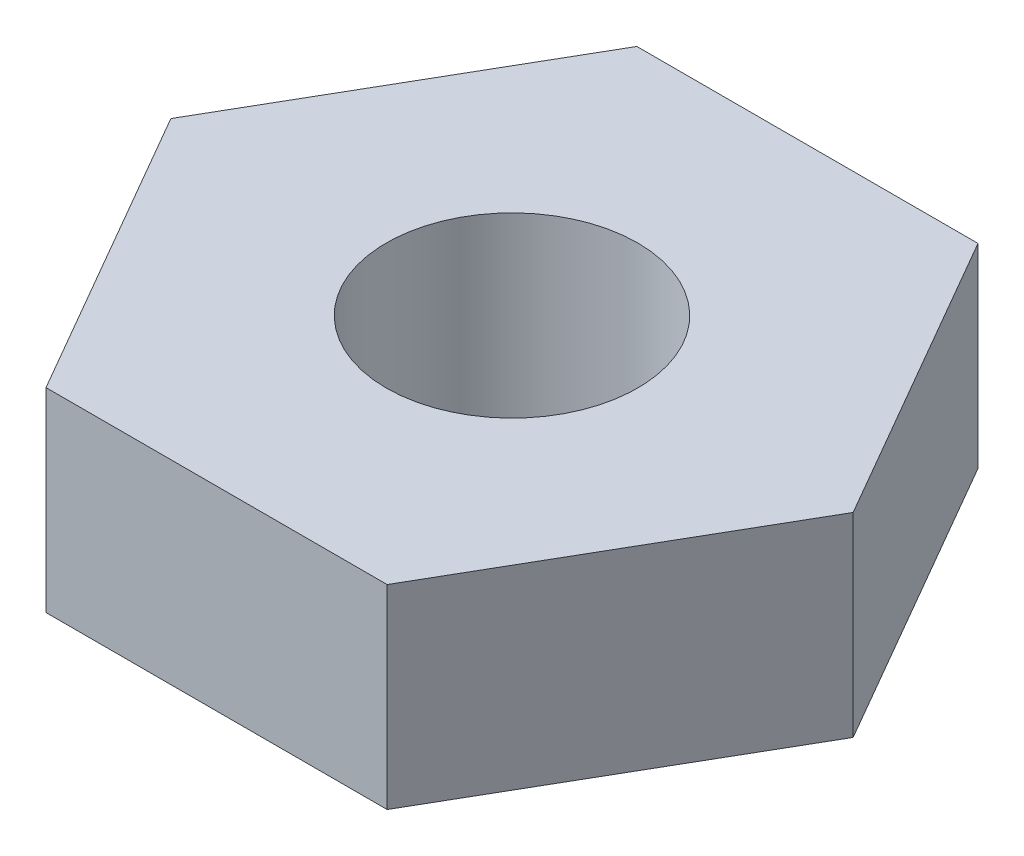
ISO-10303-21;
HEADER;
FILE_DESCRIPTION(('STEP AP214'),'2;1');
FILE_NAME('part.step','',(''),(''),'','','');
FILE_SCHEMA(('AUTOMOTIVE_DESIGN { 1 0 10303 214 1 1 1 1 }'));
ENDSEC;
DATA;
#1=APPLICATION_CONTEXT('core data for automotive mechanical design processes');
#2=APPLICATION_PROTOCOL_DEFINITION('international standard','automotive_design',2000,#1);
#3=PRODUCT_CONTEXT('',#1,'mechanical');
#4=PRODUCT('Part','Part','',(#3));
#5=PRODUCT_RELATED_PRODUCT_CATEGORY('part','',(#4));
#6=PRODUCT_DEFINITION_FORMATION('','',#4);
#7=PRODUCT_DEFINITION_CONTEXT('part definition',#1,'design');
#8=PRODUCT_DEFINITION('design','',#6,#7);
#9=PRODUCT_DEFINITION_SHAPE('','',#8);
#10=(LENGTH_UNIT() NAMED_UNIT(*) SI_UNIT(.MILLI.,.METRE.));
#11=(NAMED_UNIT(*) PLANE_ANGLE_UNIT() SI_UNIT($,.RADIAN.));
#12=(NAMED_UNIT(*) SI_UNIT($,.STERADIAN.) SOLID_ANGLE_UNIT());
#13=UNCERTAINTY_MEASURE_WITH_UNIT(LENGTH_MEASURE(1.E-05),#10,'distance_accuracy_value','');
#14=(GEOMETRIC_REPRESENTATION_CONTEXT(3) GLOBAL_UNCERTAINTY_ASSIGNED_CONTEXT((#13)) GLOBAL_UNIT_ASSIGNED_CONTEXT((#10,
#11,#12)) REPRESENTATION_CONTEXT('',''));
#15=CARTESIAN_POINT('',(0.,0.,0.));
#16=DIRECTION('',(0.,0.,1.));
#17=DIRECTION('',(1.,0.,0.));
#18=AXIS2_PLACEMENT_3D('',#15,#16,#17);
#19=CARTESIAN_POINT('',(0.,3.1,0.));
#20=DIRECTION('',(0.,1.,0.));
#21=DIRECTION('',(0.,0.,1.));
#22=AXIS2_PLACEMENT_3D('',#19,#20,#21);
#23=PLANE('',#22);
#24=DIRECTION('',(-1.,0.,0.));
#25=VECTOR('',#24,1.);
#26=CARTESIAN_POINT('',(2.71354626519124,3.1,-4.7));
#27=LINE('',#26,#25);
#28=CARTESIAN_POINT('',(2.71354626519124,3.1,-4.7));
#29=VERTEX_POINT('',#28);
#30=CARTESIAN_POINT('',(-2.71354626519124,3.1,-4.7));
#31=VERTEX_POINT('',#30);
#32=EDGE_CURVE('E131',#29,#31,#27,.T.);
#33=ORIENTED_EDGE('',*,*,#32,.T.);
#34=DIRECTION('',(-0.5,0.,0.866025403784439));
#35=VECTOR('',#34,1.);
#36=CARTESIAN_POINT('',(-2.71354626519124,3.1,-4.7));
#37=LINE('',#36,#35);
#38=CARTESIAN_POINT('',(-5.42709253038248,3.1,0.));
#39=VERTEX_POINT('',#38);
#40=EDGE_CURVE('E89',#31,#39,#37,.T.);
#41=ORIENTED_EDGE('',*,*,#40,.T.);
#42=DIRECTION('',(0.5,0.,0.866025403784438));
#43=VECTOR('',#42,1.);
#44=CARTESIAN_POINT('',(-5.42709253038248,3.1,0.));
#45=LINE('',#44,#43);
#46=CARTESIAN_POINT('',(-2.71354626519124,3.1,4.7));
#47=VERTEX_POINT('',#46);
#48=EDGE_CURVE('E102',#39,#47,#45,.T.);
#49=ORIENTED_EDGE('',*,*,#48,.T.);
#50=DIRECTION('',(1.,0.,0.));
#51=VECTOR('',#50,1.);
#52=CARTESIAN_POINT('',(-2.71354626519124,3.1,4.7));
#53=LINE('',#52,#51);
#54=CARTESIAN_POINT('',(2.71354626519124,3.1,4.7));
#55=VERTEX_POINT('',#54);
#56=EDGE_CURVE('E96',#47,#55,#53,.T.);
#57=ORIENTED_EDGE('',*,*,#56,.T.);
#58=DIRECTION('',(0.5,0.,-0.866025403784439));
#59=VECTOR('',#58,1.);
#60=CARTESIAN_POINT('',(2.71354626519124,3.1,4.7));
#61=LINE('',#60,#59);
#62=CARTESIAN_POINT('',(5.42709253038248,3.1,0.));
#63=VERTEX_POINT('',#62);
#64=EDGE_CURVE('E100',#55,#63,#61,.T.);
#65=ORIENTED_EDGE('',*,*,#64,.T.);
#66=DIRECTION('',(-0.5,0.,-0.866025403784438));
#67=VECTOR('',#66,1.);
#68=CARTESIAN_POINT('',(5.42709253038248,3.1,0.));
#69=LINE('',#68,#67);
#70=EDGE_CURVE('E52',#63,#29,#69,.T.);
#71=ORIENTED_EDGE('',*,*,#70,.T.);
#72=EDGE_LOOP('',(#33,#41,#49,#57,#65,#71));
#73=FACE_BOUND('',#72,.T.);
#74=CARTESIAN_POINT('',(0.,3.1,0.));
#75=DIRECTION('',(0.,1.,0.));
#76=DIRECTION('',(0.,0.,1.));
#77=AXIS2_PLACEMENT_3D('',#74,#75,#76);
#78=CIRCLE('',#77,2.);
#79=CARTESIAN_POINT('',(0.,3.1,-2.));
#80=VERTEX_POINT('',#79);
#81=EDGE_CURVE('E124',#80,#80,#78,.T.);
#82=ORIENTED_EDGE('',*,*,#81,.F.);
#83=EDGE_LOOP('',(#82));
#84=FACE_BOUND('',#83,.T.);
#85=ADVANCED_FACE('F35',(#73,#84),#23,.T.);
#86=CARTESIAN_POINT('',(0.,0.,0.));
#87=DIRECTION('',(0.,1.,0.));
#88=DIRECTION('',(0.,0.,1.));
#89=AXIS2_PLACEMENT_3D('',#86,#87,#88);
#90=PLANE('',#89);
#91=DIRECTION('',(-1.,0.,0.));
#92=VECTOR('',#91,1.);
#93=CARTESIAN_POINT('',(2.71354626519124,0.,-4.7));
#94=LINE('',#93,#92);
#95=CARTESIAN_POINT('',(2.71354626519124,0.,-4.7));
#96=VERTEX_POINT('',#95);
#97=CARTESIAN_POINT('',(-2.71354626519124,0.,-4.7));
#98=VERTEX_POINT('',#97);
#99=EDGE_CURVE('E120',#96,#98,#94,.T.);
#100=ORIENTED_EDGE('',*,*,#99,.F.);
#101=DIRECTION('',(-0.5,0.,-0.866025403784438));
#102=VECTOR('',#101,1.);
#103=CARTESIAN_POINT('',(5.42709253038248,0.,0.));
#104=LINE('',#103,#102);
#105=CARTESIAN_POINT('',(5.42709253038248,0.,0.));
#106=VERTEX_POINT('',#105);
#107=EDGE_CURVE('E81',#106,#96,#104,.T.);
#108=ORIENTED_EDGE('',*,*,#107,.F.);
#109=DIRECTION('',(0.5,0.,-0.866025403784439));
#110=VECTOR('',#109,1.);
#111=CARTESIAN_POINT('',(2.71354626519124,0.,4.7));
#112=LINE('',#111,#110);
#113=CARTESIAN_POINT('',(2.71354626519124,0.,4.7));
#114=VERTEX_POINT('',#113);
#115=EDGE_CURVE('E75',#114,#106,#112,.T.);
#116=ORIENTED_EDGE('',*,*,#115,.F.);
#117=DIRECTION('',(1.,0.,0.));
#118=VECTOR('',#117,1.);
#119=CARTESIAN_POINT('',(-2.71354626519124,0.,4.7));
#120=LINE('',#119,#118);
#121=CARTESIAN_POINT('',(-2.71354626519124,0.,4.7));
#122=VERTEX_POINT('',#121);
#123=EDGE_CURVE('E110',#122,#114,#120,.T.);
#124=ORIENTED_EDGE('',*,*,#123,.F.);
#125=DIRECTION('',(0.5,0.,0.866025403784438));
#126=VECTOR('',#125,1.);
#127=CARTESIAN_POINT('',(-5.42709253038248,0.,0.));
#128=LINE('',#127,#126);
#129=CARTESIAN_POINT('',(-5.42709253038248,0.,0.));
#130=VERTEX_POINT('',#129);
#131=EDGE_CURVE('E126',#130,#122,#128,.T.);
#132=ORIENTED_EDGE('',*,*,#131,.F.);
#133=DIRECTION('',(-0.5,0.,0.866025403784439));
#134=VECTOR('',#133,1.);
#135=CARTESIAN_POINT('',(-2.71354626519124,0.,-4.7));
#136=LINE('',#135,#134);
#137=EDGE_CURVE('E123',#98,#130,#136,.T.);
#138=ORIENTED_EDGE('',*,*,#137,.F.);
#139=EDGE_LOOP('',(#100,#108,#116,#124,#132,#138));
#140=FACE_BOUND('',#139,.T.);
#141=CARTESIAN_POINT('',(0.,0.,0.));
#142=DIRECTION('',(0.,1.,0.));
#143=DIRECTION('',(0.,0.,1.));
#144=AXIS2_PLACEMENT_3D('',#141,#142,#143);
#145=CIRCLE('',#144,2.);
#146=CARTESIAN_POINT('',(0.,0.,-2.));
#147=VERTEX_POINT('',#146);
#148=EDGE_CURVE('E224',#147,#147,#145,.T.);
#149=ORIENTED_EDGE('',*,*,#148,.T.);
#150=EDGE_LOOP('',(#149));
#151=FACE_BOUND('',#150,.T.);
#152=ADVANCED_FACE('F140',(#140,#151),#90,.F.);
#153=CARTESIAN_POINT('',(2.71354626519124,3.1,-4.7));
#154=DIRECTION('',(0.,0.,1.));
#155=DIRECTION('',(1.,0.,0.));
#156=AXIS2_PLACEMENT_3D('',#153,#154,#155);
#157=PLANE('',#156);
#158=ORIENTED_EDGE('',*,*,#99,.T.);
#159=DIRECTION('',(0.,-1.,0.));
#160=VECTOR('',#159,1.);
#161=CARTESIAN_POINT('',(-2.71354626519124,3.1,-4.7));
#162=LINE('',#161,#160);
#163=EDGE_CURVE('E11',#31,#98,#162,.T.);
#164=ORIENTED_EDGE('',*,*,#163,.F.);
#165=ORIENTED_EDGE('',*,*,#32,.F.);
#166=DIRECTION('',(0.,-1.,0.));
#167=VECTOR('',#166,1.);
#168=CARTESIAN_POINT('',(2.71354626519124,3.1,-4.7));
#169=LINE('',#168,#167);
#170=EDGE_CURVE('E116',#29,#96,#169,.T.);
#171=ORIENTED_EDGE('',*,*,#170,.T.);
#172=EDGE_LOOP('',(#158,#164,#165,#171));
#173=FACE_BOUND('',#172,.T.);
#174=ADVANCED_FACE('F37',(#173),#157,.F.);
#175=CARTESIAN_POINT('',(-2.71354626519124,3.1,-4.7));
#176=DIRECTION('',(0.866025403784439,0.,0.5));
#177=DIRECTION('',(0.5,0.,-0.866025403784439));
#178=AXIS2_PLACEMENT_3D('',#175,#176,#177);
#179=PLANE('',#178);
#180=ORIENTED_EDGE('',*,*,#137,.T.);
#181=DIRECTION('',(0.,-1.,0.));
#182=VECTOR('',#181,1.);
#183=CARTESIAN_POINT('',(-5.42709253038248,3.1,0.));
#184=LINE('',#183,#182);
#185=EDGE_CURVE('E44',#39,#130,#184,.T.);
#186=ORIENTED_EDGE('',*,*,#185,.F.);
#187=ORIENTED_EDGE('',*,*,#40,.F.);
#188=ORIENTED_EDGE('',*,*,#163,.T.);
#189=EDGE_LOOP('',(#180,#186,#187,#188));
#190=FACE_BOUND('',#189,.T.);
#191=ADVANCED_FACE('F165',(#190),#179,.F.);
#192=CARTESIAN_POINT('',(-5.42709253038248,3.1,0.));
#193=DIRECTION('',(0.866025403784438,0.,-0.5));
#194=DIRECTION('',(-0.5,0.,-0.866025403784439));
#195=AXIS2_PLACEMENT_3D('',#192,#193,#194);
#196=PLANE('',#195);
#197=ORIENTED_EDGE('',*,*,#131,.T.);
#198=DIRECTION('',(0.,-1.,0.));
#199=VECTOR('',#198,1.);
#200=CARTESIAN_POINT('',(-2.71354626519124,3.1,4.7));
#201=LINE('',#200,#199);
#202=EDGE_CURVE('E111',#47,#122,#201,.T.);
#203=ORIENTED_EDGE('',*,*,#202,.F.);
#204=ORIENTED_EDGE('',*,*,#48,.F.);
#205=ORIENTED_EDGE('',*,*,#185,.T.);
#206=EDGE_LOOP('',(#197,#203,#204,#205));
#207=FACE_BOUND('',#206,.T.);
#208=ADVANCED_FACE('F137',(#207),#196,.F.);
#209=CARTESIAN_POINT('',(-2.71354626519124,3.1,4.7));
#210=DIRECTION('',(0.,0.,-1.));
#211=DIRECTION('',(-1.,0.,0.));
#212=AXIS2_PLACEMENT_3D('',#209,#210,#211);
#213=PLANE('',#212);
#214=ORIENTED_EDGE('',*,*,#123,.T.);
#215=DIRECTION('',(0.,-1.,0.));
#216=VECTOR('',#215,1.);
#217=CARTESIAN_POINT('',(2.71354626519124,3.1,4.7));
#218=LINE('',#217,#216);
#219=EDGE_CURVE('E107',#55,#114,#218,.T.);
#220=ORIENTED_EDGE('',*,*,#219,.F.);
#221=ORIENTED_EDGE('',*,*,#56,.F.);
#222=ORIENTED_EDGE('',*,*,#202,.T.);
#223=EDGE_LOOP('',(#214,#220,#221,#222));
#224=FACE_BOUND('',#223,.T.);
#225=ADVANCED_FACE('F108',(#224),#213,.F.);
#226=CARTESIAN_POINT('',(2.71354626519124,3.1,4.7));
#227=DIRECTION('',(-0.866025403784439,0.,-0.5));
#228=DIRECTION('',(-0.5,0.,0.866025403784439));
#229=AXIS2_PLACEMENT_3D('',#226,#227,#228);
#230=PLANE('',#229);
#231=ORIENTED_EDGE('',*,*,#115,.T.);
#232=DIRECTION('',(0.,-1.,0.));
#233=VECTOR('',#232,1.);
#234=CARTESIAN_POINT('',(5.42709253038248,3.1,0.));
#235=LINE('',#234,#233);
#236=EDGE_CURVE('E112',#63,#106,#235,.T.);
#237=ORIENTED_EDGE('',*,*,#236,.F.);
#238=ORIENTED_EDGE('',*,*,#64,.F.);
#239=ORIENTED_EDGE('',*,*,#219,.T.);
#240=EDGE_LOOP('',(#231,#237,#238,#239));
#241=FACE_BOUND('',#240,.T.);
#242=ADVANCED_FACE('F114',(#241),#230,.F.);
#243=CARTESIAN_POINT('',(5.42709253038248,3.1,0.));
#244=DIRECTION('',(-0.866025403784438,0.,0.5));
#245=DIRECTION('',(0.5,0.,0.866025403784439));
#246=AXIS2_PLACEMENT_3D('',#243,#244,#245);
#247=PLANE('',#246);
#248=ORIENTED_EDGE('',*,*,#107,.T.);
#249=ORIENTED_EDGE('',*,*,#170,.F.);
#250=ORIENTED_EDGE('',*,*,#70,.F.);
#251=ORIENTED_EDGE('',*,*,#236,.T.);
#252=EDGE_LOOP('',(#248,#249,#250,#251));
#253=FACE_BOUND('',#252,.T.);
#254=ADVANCED_FACE('F145',(#253),#247,.F.);
#255=CARTESIAN_POINT('',(0.,3.1,0.));
#256=DIRECTION('',(0.,-1.,0.));
#257=DIRECTION('',(0.,0.,-1.));
#258=AXIS2_PLACEMENT_3D('',#255,#256,#257);
#259=CYLINDRICAL_SURFACE('',#258,2.);
#260=CARTESIAN_POINT('',(0.,3.1,-2.));
#261=CARTESIAN_POINT('',(0.,3.06770833333333,-2.));
#262=CARTESIAN_POINT('',(0.,3.03541666666667,-2.));
#263=CARTESIAN_POINT('',(0.,2.97083333333333,-2.));
#264=CARTESIAN_POINT('',(0.,2.93854166666667,-2.));
#265=CARTESIAN_POINT('',(0.,2.87395833333333,-2.));
#266=CARTESIAN_POINT('',(0.,2.84166666666667,-2.));
#267=CARTESIAN_POINT('',(0.,2.77708333333333,-2.));
#268=CARTESIAN_POINT('',(0.,2.74479166666667,-2.));
#269=CARTESIAN_POINT('',(0.,2.68020833333333,-2.));
#270=CARTESIAN_POINT('',(0.,2.64791666666667,-2.));
#271=CARTESIAN_POINT('',(0.,2.58333333333333,-2.));
#272=CARTESIAN_POINT('',(0.,2.55104166666667,-2.));
#273=CARTESIAN_POINT('',(0.,2.48645833333333,-2.));
#274=CARTESIAN_POINT('',(0.,2.45416666666667,-2.));
#275=CARTESIAN_POINT('',(0.,2.38958333333333,-2.));
#276=CARTESIAN_POINT('',(0.,2.35729166666667,-2.));
#277=CARTESIAN_POINT('',(0.,2.29270833333333,-2.));
#278=CARTESIAN_POINT('',(0.,2.26041666666667,-2.));
#279=CARTESIAN_POINT('',(0.,2.19583333333333,-2.));
#280=CARTESIAN_POINT('',(0.,2.16354166666667,-2.));
#281=CARTESIAN_POINT('',(0.,2.09895833333333,-2.));
#282=CARTESIAN_POINT('',(0.,2.06666666666667,-2.));
#283=CARTESIAN_POINT('',(0.,2.00208333333333,-2.));
#284=CARTESIAN_POINT('',(0.,1.96979166666667,-2.));
#285=CARTESIAN_POINT('',(0.,1.90520833333333,-2.));
#286=CARTESIAN_POINT('',(0.,1.87291666666667,-2.));
#287=CARTESIAN_POINT('',(0.,1.80833333333333,-2.));
#288=CARTESIAN_POINT('',(0.,1.77604166666667,-2.));
#289=CARTESIAN_POINT('',(0.,1.71145833333333,-2.));
#290=CARTESIAN_POINT('',(0.,1.67916666666667,-2.));
#291=CARTESIAN_POINT('',(0.,1.61458333333333,-2.));
#292=CARTESIAN_POINT('',(0.,1.58229166666667,-2.));
#293=CARTESIAN_POINT('',(0.,1.51770833333333,-2.));
#294=CARTESIAN_POINT('',(0.,1.48541666666667,-2.));
#295=CARTESIAN_POINT('',(0.,1.42083333333333,-2.));
#296=CARTESIAN_POINT('',(0.,1.38854166666667,-2.));
#297=CARTESIAN_POINT('',(0.,1.32395833333333,-2.));
#298=CARTESIAN_POINT('',(0.,1.29166666666667,-2.));
#299=CARTESIAN_POINT('',(0.,1.22708333333333,-2.));
#300=CARTESIAN_POINT('',(0.,1.19479166666667,-2.));
#301=CARTESIAN_POINT('',(0.,1.13020833333333,-2.));
#302=CARTESIAN_POINT('',(0.,1.09791666666667,-2.));
#303=CARTESIAN_POINT('',(0.,1.03333333333333,-2.));
#304=CARTESIAN_POINT('',(0.,1.00104166666667,-2.));
#305=CARTESIAN_POINT('',(0.,0.936458333333333,-2.));
#306=CARTESIAN_POINT('',(0.,0.904166666666667,-2.));
#307=CARTESIAN_POINT('',(0.,0.839583333333334,-2.));
#308=CARTESIAN_POINT('',(0.,0.807291666666667,-2.));
#309=CARTESIAN_POINT('',(0.,0.742708333333333,-2.));
#310=CARTESIAN_POINT('',(0.,0.710416666666667,-2.));
#311=CARTESIAN_POINT('',(0.,0.645833333333333,-2.));
#312=CARTESIAN_POINT('',(0.,0.613541666666667,-2.));
#313=CARTESIAN_POINT('',(0.,0.548958333333333,-2.));
#314=CARTESIAN_POINT('',(0.,0.516666666666667,-2.));
#315=CARTESIAN_POINT('',(0.,0.452083333333333,-2.));
#316=CARTESIAN_POINT('',(0.,0.419791666666667,-2.));
#317=CARTESIAN_POINT('',(0.,0.355208333333333,-2.));
#318=CARTESIAN_POINT('',(0.,0.322916666666667,-2.));
#319=CARTESIAN_POINT('',(0.,0.258333333333333,-2.));
#320=CARTESIAN_POINT('',(0.,0.226041666666667,-2.));
#321=CARTESIAN_POINT('',(0.,0.161458333333333,-2.));
#322=CARTESIAN_POINT('',(0.,0.129166666666667,-2.));
#323=CARTESIAN_POINT('',(0.,0.0645833333333335,-2.));
#324=CARTESIAN_POINT('',(0.,0.0322916666666667,-2.));
#325=CARTESIAN_POINT('',(0.,0.,-2.));
#326=B_SPLINE_CURVE_WITH_KNOTS('',3,(#260,#261,#262,#263,#264,#265,#266,#267,#268,#269,#270,
#271,#272,#273,#274,#275,#276,#277,#278,#279,#280,#281,#282,#283,#284,#285,#286,#287,#288,#289,
#290,#291,#292,#293,#294,#295,#296,#297,#298,#299,#300,#301,#302,#303,#304,#305,#306,#307,#308,
#309,#310,#311,#312,#313,#314,#315,#316,#317,#318,#319,#320,#321,#322,#323,#324,#325),
.UNSPECIFIED.,.F.,.F.,(4,2,2,2,2,2,2,2,2,2,2,2,2,2,2,2,2,2,2,2,2,2,2,2,2,2,2,2,2,2,2,2,4),(0.,
0.0968750000000002,0.19375,0.290625,0.3875,0.484375,0.58125,0.678125,0.775,0.871875,0.96875,
1.065625,1.1625,1.259375,1.35625,1.453125,1.55,1.646875,1.74375,1.840625,1.9375,2.034375,
2.13125,2.228125,2.325,2.421875,2.51875,2.615625,2.7125,2.809375,2.90625,3.003125,3.1),.UNSPECIFIED.);
#327=EDGE_CURVE('BSEAM147',#80,#147,#326,.T.);
#328=ORIENTED_EDGE('',*,*,#81,.T.);
#329=ORIENTED_EDGE('',*,*,#148,.F.);
#330=ORIENTED_EDGE('',*,*,#327,.T.);
#331=ORIENTED_EDGE('',*,*,#327,.F.);
#332=EDGE_LOOP('',(#328,#330,#329,#331));
#333=FACE_BOUND('',#332,.T.);
#334=ADVANCED_FACE('F147',(#333),#259,.F.);
#335=CLOSED_SHELL('',(#85,#152,#174,#191,#208,#225,#242,#254,#334));
#336=MANIFOLD_SOLID_BREP('B2',#335);
#337=ADVANCED_BREP_SHAPE_REPRESENTATION('',(#18,#336),#14);
#338=SHAPE_DEFINITION_REPRESENTATION(#9,#337);
ENDSEC;
END-ISO-10303-21;
